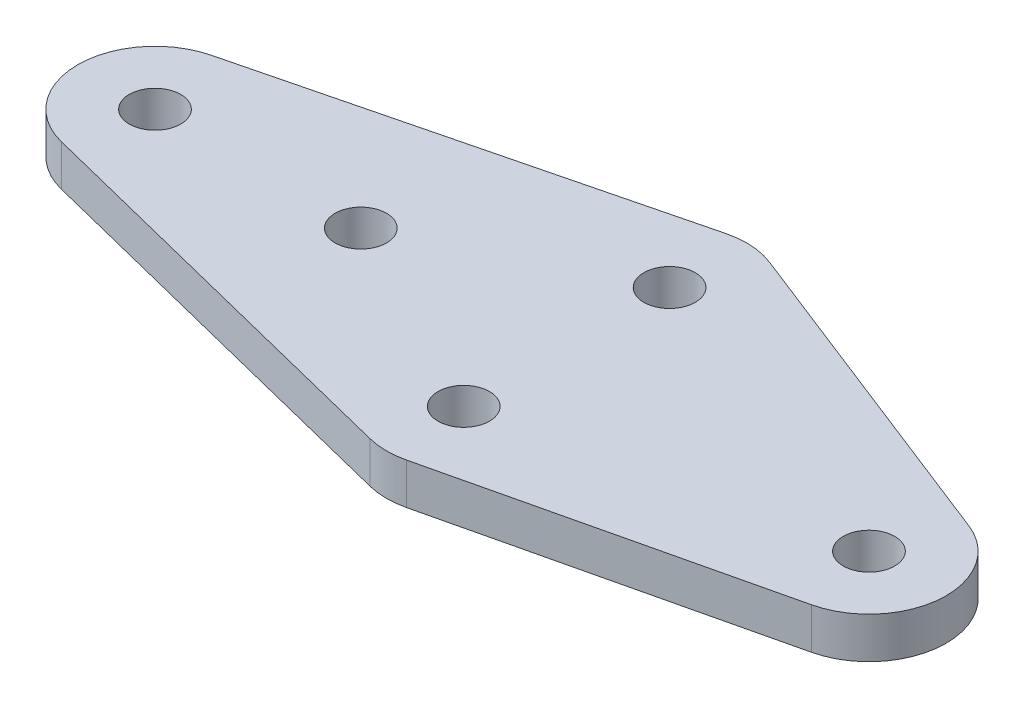
ISO-10303-21;
HEADER;
FILE_DESCRIPTION(('STEP AP214'),'2;1');
FILE_NAME('part.step','',(''),(''),'','','');
FILE_SCHEMA(('AUTOMOTIVE_DESIGN { 1 0 10303 214 1 1 1 1 }'));
ENDSEC;
DATA;
#1=APPLICATION_CONTEXT('core data for automotive mechanical design processes');
#2=APPLICATION_PROTOCOL_DEFINITION('international standard','automotive_design',2000,#1);
#3=PRODUCT_CONTEXT('',#1,'mechanical');
#4=PRODUCT('Part','Part','',(#3));
#5=PRODUCT_RELATED_PRODUCT_CATEGORY('part','',(#4));
#6=PRODUCT_DEFINITION_FORMATION('','',#4);
#7=PRODUCT_DEFINITION_CONTEXT('part definition',#1,'design');
#8=PRODUCT_DEFINITION('design','',#6,#7);
#9=PRODUCT_DEFINITION_SHAPE('','',#8);
#10=(LENGTH_UNIT() NAMED_UNIT(*) SI_UNIT(.MILLI.,.METRE.));
#11=(NAMED_UNIT(*) PLANE_ANGLE_UNIT() SI_UNIT($,.RADIAN.));
#12=(NAMED_UNIT(*) SI_UNIT($,.STERADIAN.) SOLID_ANGLE_UNIT());
#13=UNCERTAINTY_MEASURE_WITH_UNIT(LENGTH_MEASURE(1.E-05),#10,'distance_accuracy_value','');
#14=(GEOMETRIC_REPRESENTATION_CONTEXT(3) GLOBAL_UNCERTAINTY_ASSIGNED_CONTEXT((#13)) GLOBAL_UNIT_ASSIGNED_CONTEXT((#10,
#11,#12)) REPRESENTATION_CONTEXT('',''));
#15=CARTESIAN_POINT('',(0.,0.,0.));
#16=DIRECTION('',(0.,0.,1.));
#17=DIRECTION('',(1.,0.,0.));
#18=AXIS2_PLACEMENT_3D('',#15,#16,#17);
#19=CARTESIAN_POINT('',(4.06244266049866,4.,-9.99999999999999));
#20=DIRECTION('',(0.,1.,0.));
#21=DIRECTION('',(0.,0.,1.));
#22=AXIS2_PLACEMENT_3D('',#19,#20,#21);
#23=PLANE('',#22);
#24=CARTESIAN_POINT('',(-15.9375573395013,4.,0.));
#25=DIRECTION('',(0.,1.,0.));
#26=DIRECTION('',(0.,0.,-1.));
#27=AXIS2_PLACEMENT_3D('',#24,#25,#26);
#28=CIRCLE('',#27,2.50000000000001);
#29=CARTESIAN_POINT('',(-15.9375573395013,4.,-2.50000000000001));
#30=VERTEX_POINT('',#29);
#31=EDGE_CURVE('E197',#30,#30,#28,.T.);
#32=ORIENTED_EDGE('',*,*,#31,.F.);
#33=EDGE_LOOP('',(#32));
#34=FACE_BOUND('',#33,.T.);
#35=CARTESIAN_POINT('',(4.06244266049866,4.,-9.99999999999999));
#36=DIRECTION('',(0.,1.,0.));
#37=DIRECTION('',(0.,0.,1.));
#38=AXIS2_PLACEMENT_3D('',#35,#36,#37);
#39=CIRCLE('',#38,2.5);
#40=CARTESIAN_POINT('',(4.06244266049866,4.,-7.5));
#41=VERTEX_POINT('',#40);
#42=EDGE_CURVE('E185',#41,#41,#39,.T.);
#43=ORIENTED_EDGE('',*,*,#42,.F.);
#44=EDGE_LOOP('',(#43));
#45=FACE_BOUND('',#44,.T.);
#46=CARTESIAN_POINT('',(4.06244266049866,4.,-9.99999999999999));
#47=DIRECTION('',(0.,1.,0.));
#48=DIRECTION('',(0.,0.,1.));
#49=AXIS2_PLACEMENT_3D('',#46,#47,#48);
#50=CIRCLE('',#49,7.50000000000002);
#51=CARTESIAN_POINT('',(6.80059058846218,4.,-16.9823023369508));
#52=VERTEX_POINT('',#51);
#53=CARTESIAN_POINT('',(2.24342547272616,4.,-17.27606875109));
#54=VERTEX_POINT('',#53);
#55=EDGE_CURVE('E148',#52,#54,#50,.T.);
#56=ORIENTED_EDGE('',*,*,#55,.T.);
#57=DIRECTION('',(-0.970142500145332,0.,0.242535625036333));
#58=VECTOR('',#57,1.);
#59=CARTESIAN_POINT('',(-37.7565745272738,4.,-7.27606875109001));
#60=LINE('',#59,#58);
#61=CARTESIAN_POINT('',(-37.7565745272738,4.,-7.27606875109001));
#62=VERTEX_POINT('',#61);
#63=EDGE_CURVE('E96',#54,#62,#60,.T.);
#64=ORIENTED_EDGE('',*,*,#63,.T.);
#65=CARTESIAN_POINT('',(-35.9375573395013,4.,0.));
#66=DIRECTION('',(0.,1.,0.));
#67=DIRECTION('',(0.,0.,-1.));
#68=AXIS2_PLACEMENT_3D('',#65,#66,#67);
#69=CIRCLE('',#68,7.50000000000002);
#70=CARTESIAN_POINT('',(-37.7565745272738,4.,7.27606875109001));
#71=VERTEX_POINT('',#70);
#72=EDGE_CURVE('E163',#62,#71,#69,.T.);
#73=ORIENTED_EDGE('',*,*,#72,.T.);
#74=DIRECTION('',(0.970142500145332,0.,0.242535625036333));
#75=VECTOR('',#74,1.);
#76=CARTESIAN_POINT('',(-37.7565745272738,4.,7.27606875109001));
#77=LINE('',#76,#75);
#78=CARTESIAN_POINT('',(2.24342547272616,4.,17.27606875109));
#79=VERTEX_POINT('',#78);
#80=EDGE_CURVE('E176',#71,#79,#77,.T.);
#81=ORIENTED_EDGE('',*,*,#80,.T.);
#82=CARTESIAN_POINT('',(4.06244266049866,4.,9.99999999999999));
#83=DIRECTION('',(0.,1.,0.));
#84=DIRECTION('',(0.,0.,-1.));
#85=AXIS2_PLACEMENT_3D('',#82,#83,#84);
#86=CIRCLE('',#85,7.50000000000002);
#87=CARTESIAN_POINT('',(5.7802318074327,4.,17.3006301403835));
#88=VERTEX_POINT('',#87);
#89=EDGE_CURVE('E115',#79,#88,#86,.T.);
#90=ORIENTED_EDGE('',*,*,#89,.T.);
#91=DIRECTION('',(0.97341735205113,0.,-0.229038552924539));
#92=VECTOR('',#91,1.);
#93=CARTESIAN_POINT('',(5.7802318074327,4.,17.3006301403835));
#94=LINE('',#93,#92);
#95=CARTESIAN_POINT('',(37.6553464864336,4.,9.8006301403849));
#96=VERTEX_POINT('',#95);
#97=EDGE_CURVE('E109',#88,#96,#94,.T.);
#98=ORIENTED_EDGE('',*,*,#97,.T.);
#99=CARTESIAN_POINT('',(35.9375573394988,4.,2.50000000000209));
#100=DIRECTION('',(0.,1.,0.));
#101=DIRECTION('',(0.,0.,1.));
#102=AXIS2_PLACEMENT_3D('',#99,#100,#101);
#103=CIRCLE('',#102,7.49999999999952);
#104=CARTESIAN_POINT('',(38.6757052674614,4.,-4.48230233694863));
#105=VERTEX_POINT('',#104);
#106=EDGE_CURVE('E113',#96,#105,#103,.T.);
#107=ORIENTED_EDGE('',*,*,#106,.T.);
#108=DIRECTION('',(-0.930973644926778,0.,-0.365086390395135));
#109=VECTOR('',#108,1.);
#110=CARTESIAN_POINT('',(6.80059058846218,4.,-16.9823023369508));
#111=LINE('',#110,#109);
#112=EDGE_CURVE('E53',#105,#52,#111,.T.);
#113=ORIENTED_EDGE('',*,*,#112,.T.);
#114=EDGE_LOOP('',(#56,#64,#73,#81,#90,#98,#107,#113));
#115=FACE_BOUND('',#114,.T.);
#116=CARTESIAN_POINT('',(35.937557339499,4.,2.49999999999918));
#117=DIRECTION('',(0.,1.,0.));
#118=DIRECTION('',(0.,0.,1.));
#119=AXIS2_PLACEMENT_3D('',#116,#117,#118);
#120=CIRCLE('',#119,2.5000000000016);
#121=CARTESIAN_POINT('',(35.937557339499,4.,5.00000000000079));
#122=VERTEX_POINT('',#121);
#123=EDGE_CURVE('E137',#122,#122,#120,.T.);
#124=ORIENTED_EDGE('',*,*,#123,.F.);
#125=EDGE_LOOP('',(#124));
#126=FACE_BOUND('',#125,.T.);
#127=CARTESIAN_POINT('',(4.06244266049866,4.,9.99999999999999));
#128=DIRECTION('',(0.,1.,0.));
#129=DIRECTION('',(0.,0.,-1.));
#130=AXIS2_PLACEMENT_3D('',#127,#128,#129);
#131=CIRCLE('',#130,2.5);
#132=CARTESIAN_POINT('',(4.06244266049866,4.,7.5));
#133=VERTEX_POINT('',#132);
#134=EDGE_CURVE('E191',#133,#133,#131,.T.);
#135=ORIENTED_EDGE('',*,*,#134,.F.);
#136=EDGE_LOOP('',(#135));
#137=FACE_BOUND('',#136,.T.);
#138=CARTESIAN_POINT('',(-35.9375573395013,4.,0.));
#139=DIRECTION('',(0.,1.,0.));
#140=DIRECTION('',(0.,0.,-1.));
#141=AXIS2_PLACEMENT_3D('',#138,#139,#140);
#142=CIRCLE('',#141,2.5);
#143=CARTESIAN_POINT('',(-35.9375573395013,4.,-2.5));
#144=VERTEX_POINT('',#143);
#145=EDGE_CURVE('E203',#144,#144,#142,.T.);
#146=ORIENTED_EDGE('',*,*,#145,.F.);
#147=EDGE_LOOP('',(#146));
#148=FACE_BOUND('',#147,.T.);
#149=ADVANCED_FACE('F36',(#34,#45,#115,#126,#137,#148),#23,.T.);
#150=CARTESIAN_POINT('',(4.06244266049866,0.,-9.99999999999999));
#151=DIRECTION('',(0.,1.,0.));
#152=DIRECTION('',(0.,0.,1.));
#153=AXIS2_PLACEMENT_3D('',#150,#151,#152);
#154=PLANE('',#153);
#155=CARTESIAN_POINT('',(4.06244266049866,0.,-9.99999999999999));
#156=DIRECTION('',(0.,1.,0.));
#157=DIRECTION('',(0.,0.,1.));
#158=AXIS2_PLACEMENT_3D('',#155,#156,#157);
#159=CIRCLE('',#158,7.50000000000002);
#160=CARTESIAN_POINT('',(6.80059058846218,0.,-16.9823023369508));
#161=VERTEX_POINT('',#160);
#162=CARTESIAN_POINT('',(2.24342547272616,0.,-17.27606875109));
#163=VERTEX_POINT('',#162);
#164=EDGE_CURVE('E133',#161,#163,#159,.T.);
#165=ORIENTED_EDGE('',*,*,#164,.F.);
#166=DIRECTION('',(-0.930973644926778,0.,-0.365086390395135));
#167=VECTOR('',#166,1.);
#168=CARTESIAN_POINT('',(6.80059058846218,0.,-16.9823023369508));
#169=LINE('',#168,#167);
#170=CARTESIAN_POINT('',(38.6757052674614,0.,-4.48230233694863));
#171=VERTEX_POINT('',#170);
#172=EDGE_CURVE('E88',#171,#161,#169,.T.);
#173=ORIENTED_EDGE('',*,*,#172,.F.);
#174=CARTESIAN_POINT('',(35.9375573394988,0.,2.50000000000209));
#175=DIRECTION('',(0.,1.,0.));
#176=DIRECTION('',(0.,0.,1.));
#177=AXIS2_PLACEMENT_3D('',#174,#175,#176);
#178=CIRCLE('',#177,7.49999999999952);
#179=CARTESIAN_POINT('',(37.6553464864336,0.,9.8006301403849));
#180=VERTEX_POINT('',#179);
#181=EDGE_CURVE('E82',#180,#171,#178,.T.);
#182=ORIENTED_EDGE('',*,*,#181,.F.);
#183=DIRECTION('',(0.97341735205113,0.,-0.229038552924539));
#184=VECTOR('',#183,1.);
#185=CARTESIAN_POINT('',(5.7802318074327,0.,17.3006301403835));
#186=LINE('',#185,#184);
#187=CARTESIAN_POINT('',(5.7802318074327,0.,17.3006301403835));
#188=VERTEX_POINT('',#187);
#189=EDGE_CURVE('E123',#188,#180,#186,.T.);
#190=ORIENTED_EDGE('',*,*,#189,.F.);
#191=CARTESIAN_POINT('',(4.06244266049866,0.,9.99999999999999));
#192=DIRECTION('',(0.,1.,0.));
#193=DIRECTION('',(0.,0.,-1.));
#194=AXIS2_PLACEMENT_3D('',#191,#192,#193);
#195=CIRCLE('',#194,7.50000000000002);
#196=CARTESIAN_POINT('',(2.24342547272616,0.,17.27606875109));
#197=VERTEX_POINT('',#196);
#198=EDGE_CURVE('E143',#197,#188,#195,.T.);
#199=ORIENTED_EDGE('',*,*,#198,.F.);
#200=DIRECTION('',(0.970142500145332,0.,0.242535625036333));
#201=VECTOR('',#200,1.);
#202=CARTESIAN_POINT('',(-37.7565745272738,0.,7.27606875109001));
#203=LINE('',#202,#201);
#204=CARTESIAN_POINT('',(-37.7565745272738,0.,7.27606875109001));
#205=VERTEX_POINT('',#204);
#206=EDGE_CURVE('E141',#205,#197,#203,.T.);
#207=ORIENTED_EDGE('',*,*,#206,.F.);
#208=CARTESIAN_POINT('',(-35.9375573395013,0.,0.));
#209=DIRECTION('',(0.,1.,0.));
#210=DIRECTION('',(0.,0.,-1.));
#211=AXIS2_PLACEMENT_3D('',#208,#209,#210);
#212=CIRCLE('',#211,7.50000000000002);
#213=CARTESIAN_POINT('',(-37.7565745272738,0.,-7.27606875109001));
#214=VERTEX_POINT('',#213);
#215=EDGE_CURVE('E139',#214,#205,#212,.T.);
#216=ORIENTED_EDGE('',*,*,#215,.F.);
#217=DIRECTION('',(-0.970142500145332,0.,0.242535625036333));
#218=VECTOR('',#217,1.);
#219=CARTESIAN_POINT('',(-37.7565745272738,0.,-7.27606875109001));
#220=LINE('',#219,#218);
#221=EDGE_CURVE('E136',#163,#214,#220,.T.);
#222=ORIENTED_EDGE('',*,*,#221,.F.);
#223=EDGE_LOOP('',(#165,#173,#182,#190,#199,#207,#216,#222));
#224=FACE_BOUND('',#223,.T.);
#225=CARTESIAN_POINT('',(35.937557339499,0.,2.49999999999918));
#226=DIRECTION('',(0.,1.,0.));
#227=DIRECTION('',(0.,0.,1.));
#228=AXIS2_PLACEMENT_3D('',#225,#226,#227);
#229=CIRCLE('',#228,2.5000000000016);
#230=CARTESIAN_POINT('',(35.937557339499,0.,5.00000000000079));
#231=VERTEX_POINT('',#230);
#232=EDGE_CURVE('E182',#231,#231,#229,.T.);
#233=ORIENTED_EDGE('',*,*,#232,.T.);
#234=EDGE_LOOP('',(#233));
#235=FACE_BOUND('',#234,.T.);
#236=CARTESIAN_POINT('',(4.06244266049866,0.,-9.99999999999999));
#237=DIRECTION('',(0.,1.,0.));
#238=DIRECTION('',(0.,0.,1.));
#239=AXIS2_PLACEMENT_3D('',#236,#237,#238);
#240=CIRCLE('',#239,2.5);
#241=CARTESIAN_POINT('',(4.06244266049866,0.,-7.5));
#242=VERTEX_POINT('',#241);
#243=EDGE_CURVE('E188',#242,#242,#240,.T.);
#244=ORIENTED_EDGE('',*,*,#243,.T.);
#245=EDGE_LOOP('',(#244));
#246=FACE_BOUND('',#245,.T.);
#247=CARTESIAN_POINT('',(4.06244266049866,0.,9.99999999999999));
#248=DIRECTION('',(0.,1.,0.));
#249=DIRECTION('',(0.,0.,-1.));
#250=AXIS2_PLACEMENT_3D('',#247,#248,#249);
#251=CIRCLE('',#250,2.5);
#252=CARTESIAN_POINT('',(4.06244266049866,0.,7.5));
#253=VERTEX_POINT('',#252);
#254=EDGE_CURVE('E194',#253,#253,#251,.T.);
#255=ORIENTED_EDGE('',*,*,#254,.T.);
#256=EDGE_LOOP('',(#255));
#257=FACE_BOUND('',#256,.T.);
#258=CARTESIAN_POINT('',(-15.9375573395013,0.,0.));
#259=DIRECTION('',(0.,1.,0.));
#260=DIRECTION('',(0.,0.,-1.));
#261=AXIS2_PLACEMENT_3D('',#258,#259,#260);
#262=CIRCLE('',#261,2.50000000000001);
#263=CARTESIAN_POINT('',(-15.9375573395013,0.,-2.50000000000001));
#264=VERTEX_POINT('',#263);
#265=EDGE_CURVE('E200',#264,#264,#262,.T.);
#266=ORIENTED_EDGE('',*,*,#265,.T.);
#267=EDGE_LOOP('',(#266));
#268=FACE_BOUND('',#267,.T.);
#269=CARTESIAN_POINT('',(-35.9375573395013,0.,0.));
#270=DIRECTION('',(0.,1.,0.));
#271=DIRECTION('',(0.,0.,-1.));
#272=AXIS2_PLACEMENT_3D('',#269,#270,#271);
#273=CIRCLE('',#272,2.5);
#274=CARTESIAN_POINT('',(-35.9375573395013,0.,-2.5));
#275=VERTEX_POINT('',#274);
#276=EDGE_CURVE('E206',#275,#275,#273,.T.);
#277=ORIENTED_EDGE('',*,*,#276,.T.);
#278=EDGE_LOOP('',(#277));
#279=FACE_BOUND('',#278,.T.);
#280=ADVANCED_FACE('F167',(#224,#235,#246,#257,#268,#279),#154,.F.);
#281=CARTESIAN_POINT('',(4.06244266049866,4.,-9.99999999999999));
#282=DIRECTION('',(0.,-1.,0.));
#283=DIRECTION('',(0.,0.,-1.));
#284=AXIS2_PLACEMENT_3D('',#281,#282,#283);
#285=CYLINDRICAL_SURFACE('',#284,7.50000000000002);
#286=ORIENTED_EDGE('',*,*,#164,.T.);
#287=DIRECTION('',(0.,-1.,0.));
#288=VECTOR('',#287,1.);
#289=CARTESIAN_POINT('',(2.24342547272616,4.,-17.27606875109));
#290=LINE('',#289,#288);
#291=EDGE_CURVE('E11',#54,#163,#290,.T.);
#292=ORIENTED_EDGE('',*,*,#291,.F.);
#293=ORIENTED_EDGE('',*,*,#55,.F.);
#294=DIRECTION('',(0.,-1.,0.));
#295=VECTOR('',#294,1.);
#296=CARTESIAN_POINT('',(6.80059058846218,4.,-16.9823023369508));
#297=LINE('',#296,#295);
#298=EDGE_CURVE('E129',#52,#161,#297,.T.);
#299=ORIENTED_EDGE('',*,*,#298,.T.);
#300=EDGE_LOOP('',(#286,#292,#293,#299));
#301=FACE_BOUND('',#300,.T.);
#302=ADVANCED_FACE('F38',(#301),#285,.T.);
#303=CARTESIAN_POINT('',(-37.7565745272738,4.,-7.27606875109001));
#304=DIRECTION('',(0.242535625036333,0.,0.970142500145332));
#305=DIRECTION('',(0.970142500145332,0.,-0.242535625036333));
#306=AXIS2_PLACEMENT_3D('',#303,#304,#305);
#307=PLANE('',#306);
#308=ORIENTED_EDGE('',*,*,#221,.T.);
#309=DIRECTION('',(0.,-1.,0.));
#310=VECTOR('',#309,1.);
#311=CARTESIAN_POINT('',(-37.7565745272738,4.,-7.27606875109001));
#312=LINE('',#311,#310);
#313=EDGE_CURVE('E45',#62,#214,#312,.T.);
#314=ORIENTED_EDGE('',*,*,#313,.F.);
#315=ORIENTED_EDGE('',*,*,#63,.F.);
#316=ORIENTED_EDGE('',*,*,#291,.T.);
#317=EDGE_LOOP('',(#308,#314,#315,#316));
#318=FACE_BOUND('',#317,.T.);
#319=ADVANCED_FACE('F240',(#318),#307,.F.);
#320=CARTESIAN_POINT('',(-35.9375573395013,4.,0.));
#321=DIRECTION('',(0.,-1.,0.));
#322=DIRECTION('',(0.,0.,-1.));
#323=AXIS2_PLACEMENT_3D('',#320,#321,#322);
#324=CYLINDRICAL_SURFACE('',#323,7.50000000000002);
#325=ORIENTED_EDGE('',*,*,#215,.T.);
#326=DIRECTION('',(0.,-1.,0.));
#327=VECTOR('',#326,1.);
#328=CARTESIAN_POINT('',(-37.7565745272738,4.,7.27606875109001));
#329=LINE('',#328,#327);
#330=EDGE_CURVE('E155',#71,#205,#329,.T.);
#331=ORIENTED_EDGE('',*,*,#330,.F.);
#332=ORIENTED_EDGE('',*,*,#72,.F.);
#333=ORIENTED_EDGE('',*,*,#313,.T.);
#334=EDGE_LOOP('',(#325,#331,#332,#333));
#335=FACE_BOUND('',#334,.T.);
#336=ADVANCED_FACE('F161',(#335),#324,.T.);
#337=CARTESIAN_POINT('',(-37.7565745272738,4.,7.27606875109001));
#338=DIRECTION('',(0.242535625036333,0.,-0.970142500145332));
#339=DIRECTION('',(-0.970142500145332,0.,-0.242535625036333));
#340=AXIS2_PLACEMENT_3D('',#337,#338,#339);
#341=PLANE('',#340);
#342=ORIENTED_EDGE('',*,*,#206,.T.);
#343=DIRECTION('',(0.,-1.,0.));
#344=VECTOR('',#343,1.);
#345=CARTESIAN_POINT('',(2.24342547272616,4.,17.27606875109));
#346=LINE('',#345,#344);
#347=EDGE_CURVE('E152',#79,#197,#346,.T.);
#348=ORIENTED_EDGE('',*,*,#347,.F.);
#349=ORIENTED_EDGE('',*,*,#80,.F.);
#350=ORIENTED_EDGE('',*,*,#330,.T.);
#351=EDGE_LOOP('',(#342,#348,#349,#350));
#352=FACE_BOUND('',#351,.T.);
#353=ADVANCED_FACE('F172',(#352),#341,.F.);
#354=CARTESIAN_POINT('',(4.06244266049866,4.,9.99999999999999));
#355=DIRECTION('',(0.,-1.,0.));
#356=DIRECTION('',(0.,0.,-1.));
#357=AXIS2_PLACEMENT_3D('',#354,#355,#356);
#358=CYLINDRICAL_SURFACE('',#357,7.50000000000002);
#359=ORIENTED_EDGE('',*,*,#198,.T.);
#360=DIRECTION('',(0.,-1.,0.));
#361=VECTOR('',#360,1.);
#362=CARTESIAN_POINT('',(5.7802318074327,4.,17.3006301403835));
#363=LINE('',#362,#361);
#364=EDGE_CURVE('E124',#88,#188,#363,.T.);
#365=ORIENTED_EDGE('',*,*,#364,.F.);
#366=ORIENTED_EDGE('',*,*,#89,.F.);
#367=ORIENTED_EDGE('',*,*,#347,.T.);
#368=EDGE_LOOP('',(#359,#365,#366,#367));
#369=FACE_BOUND('',#368,.T.);
#370=ADVANCED_FACE('F175',(#369),#358,.T.);
#371=CARTESIAN_POINT('',(5.7802318074327,4.,17.3006301403835));
#372=DIRECTION('',(-0.229038552924539,0.,-0.97341735205113));
#373=DIRECTION('',(-0.97341735205113,0.,0.229038552924539));
#374=AXIS2_PLACEMENT_3D('',#371,#372,#373);
#375=PLANE('',#374);
#376=ORIENTED_EDGE('',*,*,#189,.T.);
#377=DIRECTION('',(0.,-1.,0.));
#378=VECTOR('',#377,1.);
#379=CARTESIAN_POINT('',(37.6553464864336,4.,9.8006301403849));
#380=LINE('',#379,#378);
#381=EDGE_CURVE('E120',#96,#180,#380,.T.);
#382=ORIENTED_EDGE('',*,*,#381,.F.);
#383=ORIENTED_EDGE('',*,*,#97,.F.);
#384=ORIENTED_EDGE('',*,*,#364,.T.);
#385=EDGE_LOOP('',(#376,#382,#383,#384));
#386=FACE_BOUND('',#385,.T.);
#387=ADVANCED_FACE('F121',(#386),#375,.F.);
#388=CARTESIAN_POINT('',(35.9375573394988,4.,2.50000000000209));
#389=DIRECTION('',(0.,-1.,0.));
#390=DIRECTION('',(0.,0.,-1.));
#391=AXIS2_PLACEMENT_3D('',#388,#389,#390);
#392=CYLINDRICAL_SURFACE('',#391,7.49999999999952);
#393=ORIENTED_EDGE('',*,*,#181,.T.);
#394=DIRECTION('',(0.,-1.,0.));
#395=VECTOR('',#394,1.);
#396=CARTESIAN_POINT('',(38.6757052674614,4.,-4.48230233694863));
#397=LINE('',#396,#395);
#398=EDGE_CURVE('E125',#105,#171,#397,.T.);
#399=ORIENTED_EDGE('',*,*,#398,.F.);
#400=ORIENTED_EDGE('',*,*,#106,.F.);
#401=ORIENTED_EDGE('',*,*,#381,.T.);
#402=EDGE_LOOP('',(#393,#399,#400,#401));
#403=FACE_BOUND('',#402,.T.);
#404=ADVANCED_FACE('F127',(#403),#392,.T.);
#405=CARTESIAN_POINT('',(6.80059058846218,4.,-16.9823023369508));
#406=DIRECTION('',(-0.365086390395135,0.,0.930973644926778));
#407=DIRECTION('',(0.930973644926778,0.,0.365086390395135));
#408=AXIS2_PLACEMENT_3D('',#405,#406,#407);
#409=PLANE('',#408);
#410=ORIENTED_EDGE('',*,*,#172,.T.);
#411=ORIENTED_EDGE('',*,*,#298,.F.);
#412=ORIENTED_EDGE('',*,*,#112,.F.);
#413=ORIENTED_EDGE('',*,*,#398,.T.);
#414=EDGE_LOOP('',(#410,#411,#412,#413));
#415=FACE_BOUND('',#414,.T.);
#416=ADVANCED_FACE('F228',(#415),#409,.F.);
#417=CARTESIAN_POINT('',(35.937557339499,4.,2.49999999999918));
#418=DIRECTION('',(0.,-1.,0.));
#419=DIRECTION('',(0.,0.,-1.));
#420=AXIS2_PLACEMENT_3D('',#417,#418,#419);
#421=CYLINDRICAL_SURFACE('',#420,2.5000000000016);
#422=ORIENTED_EDGE('',*,*,#123,.T.);
#423=EDGE_LOOP('',(#422));
#424=FACE_BOUND('',#423,.T.);
#425=ORIENTED_EDGE('',*,*,#232,.F.);
#426=EDGE_LOOP('',(#425));
#427=FACE_BOUND('',#426,.T.);
#428=ADVANCED_FACE('F225',(#424,#427),#421,.F.);
#429=CARTESIAN_POINT('',(4.06244266049866,4.,-9.99999999999999));
#430=DIRECTION('',(0.,-1.,0.));
#431=DIRECTION('',(0.,0.,-1.));
#432=AXIS2_PLACEMENT_3D('',#429,#430,#431);
#433=CYLINDRICAL_SURFACE('',#432,2.5);
#434=ORIENTED_EDGE('',*,*,#42,.T.);
#435=EDGE_LOOP('',(#434));
#436=FACE_BOUND('',#435,.T.);
#437=ORIENTED_EDGE('',*,*,#243,.F.);
#438=EDGE_LOOP('',(#437));
#439=FACE_BOUND('',#438,.T.);
#440=ADVANCED_FACE('F304',(#436,#439),#433,.F.);
#441=CARTESIAN_POINT('',(4.06244266049866,4.,9.99999999999999));
#442=DIRECTION('',(0.,-1.,0.));
#443=DIRECTION('',(0.,0.,-1.));
#444=AXIS2_PLACEMENT_3D('',#441,#442,#443);
#445=CYLINDRICAL_SURFACE('',#444,2.5);
#446=ORIENTED_EDGE('',*,*,#134,.T.);
#447=EDGE_LOOP('',(#446));
#448=FACE_BOUND('',#447,.T.);
#449=ORIENTED_EDGE('',*,*,#254,.F.);
#450=EDGE_LOOP('',(#449));
#451=FACE_BOUND('',#450,.T.);
#452=ADVANCED_FACE('F312',(#448,#451),#445,.F.);
#453=CARTESIAN_POINT('',(-15.9375573395013,4.,0.));
#454=DIRECTION('',(0.,-1.,0.));
#455=DIRECTION('',(0.,0.,-1.));
#456=AXIS2_PLACEMENT_3D('',#453,#454,#455);
#457=CYLINDRICAL_SURFACE('',#456,2.50000000000001);
#458=ORIENTED_EDGE('',*,*,#31,.T.);
#459=EDGE_LOOP('',(#458));
#460=FACE_BOUND('',#459,.T.);
#461=ORIENTED_EDGE('',*,*,#265,.F.);
#462=EDGE_LOOP('',(#461));
#463=FACE_BOUND('',#462,.T.);
#464=ADVANCED_FACE('F320',(#460,#463),#457,.F.);
#465=CARTESIAN_POINT('',(-35.9375573395013,4.,0.));
#466=DIRECTION('',(0.,-1.,0.));
#467=DIRECTION('',(0.,0.,-1.));
#468=AXIS2_PLACEMENT_3D('',#465,#466,#467);
#469=CYLINDRICAL_SURFACE('',#468,2.5);
#470=ORIENTED_EDGE('',*,*,#145,.T.);
#471=EDGE_LOOP('',(#470));
#472=FACE_BOUND('',#471,.T.);
#473=ORIENTED_EDGE('',*,*,#276,.F.);
#474=EDGE_LOOP('',(#473));
#475=FACE_BOUND('',#474,.T.);
#476=ADVANCED_FACE('F212',(#472,#475),#469,.F.);
#477=CLOSED_SHELL('',(#149,#280,#302,#319,#336,#353,#370,#387,#404,#416,#428,#440,#452,#464,#476));
#478=MANIFOLD_SOLID_BREP('B2',#477);
#479=ADVANCED_BREP_SHAPE_REPRESENTATION('',(#18,#478),#14);
#480=SHAPE_DEFINITION_REPRESENTATION(#9,#479);
ENDSEC;
END-ISO-10303-21;
